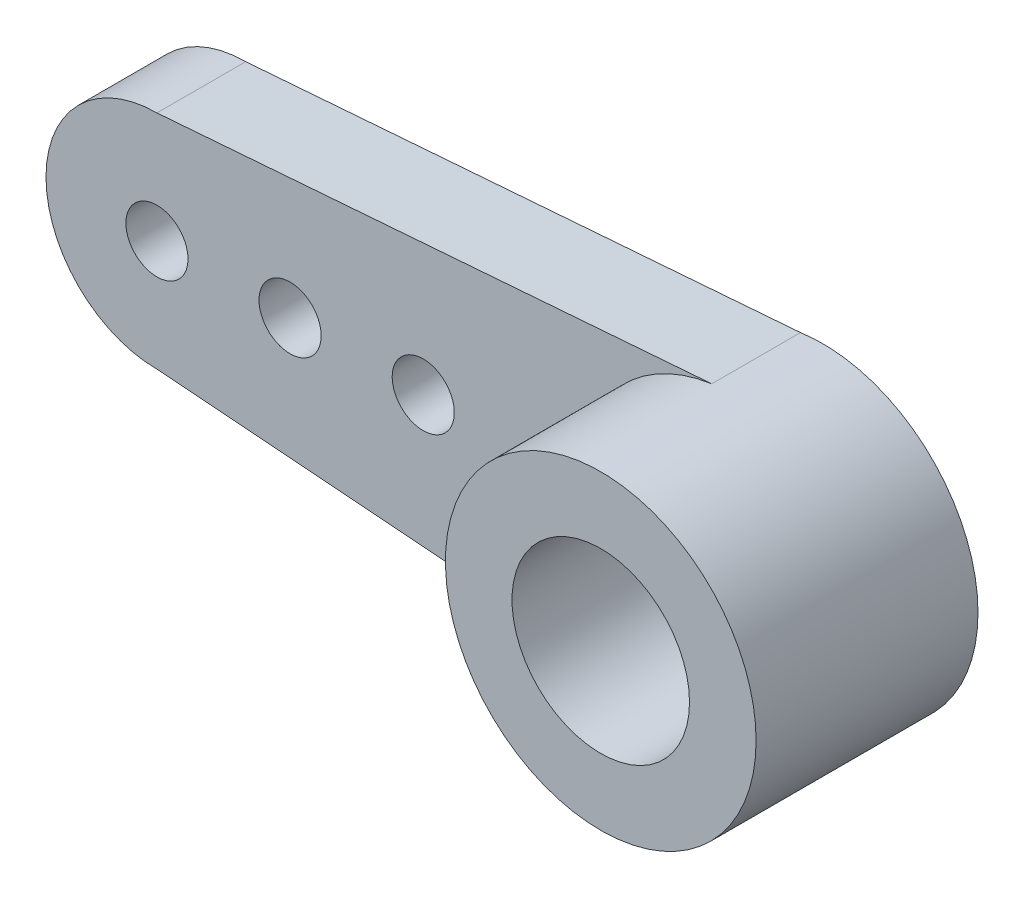
ISO-10303-21;
HEADER;
FILE_DESCRIPTION(('STEP AP214'),'2;1');
FILE_NAME('part.step','',(''),(''),'','','');
FILE_SCHEMA(('AUTOMOTIVE_DESIGN { 1 0 10303 214 1 1 1 1 }'));
ENDSEC;
DATA;
#1=APPLICATION_CONTEXT('core data for automotive mechanical design processes');
#2=APPLICATION_PROTOCOL_DEFINITION('international standard','automotive_design',2000,#1);
#3=PRODUCT_CONTEXT('',#1,'mechanical');
#4=PRODUCT('Part','Part','',(#3));
#5=PRODUCT_RELATED_PRODUCT_CATEGORY('part','',(#4));
#6=PRODUCT_DEFINITION_FORMATION('','',#4);
#7=PRODUCT_DEFINITION_CONTEXT('part definition',#1,'design');
#8=PRODUCT_DEFINITION('design','',#6,#7);
#9=PRODUCT_DEFINITION_SHAPE('','',#8);
#10=(LENGTH_UNIT() NAMED_UNIT(*) SI_UNIT(.MILLI.,.METRE.));
#11=(NAMED_UNIT(*) PLANE_ANGLE_UNIT() SI_UNIT($,.RADIAN.));
#12=(NAMED_UNIT(*) SI_UNIT($,.STERADIAN.) SOLID_ANGLE_UNIT());
#13=UNCERTAINTY_MEASURE_WITH_UNIT(LENGTH_MEASURE(1.E-05),#10,'distance_accuracy_value','');
#14=(GEOMETRIC_REPRESENTATION_CONTEXT(3) GLOBAL_UNCERTAINTY_ASSIGNED_CONTEXT((#13)) GLOBAL_UNIT_ASSIGNED_CONTEXT((#10,
#11,#12)) REPRESENTATION_CONTEXT('',''));
#15=CARTESIAN_POINT('',(0.,0.,0.));
#16=DIRECTION('',(0.,0.,1.));
#17=DIRECTION('',(1.,0.,0.));
#18=AXIS2_PLACEMENT_3D('',#15,#16,#17);
#19=CARTESIAN_POINT('',(0.,0.,5.));
#20=DIRECTION('',(0.,0.,1.));
#21=DIRECTION('',(1.,0.,0.));
#22=AXIS2_PLACEMENT_3D('',#19,#20,#21);
#23=PLANE('',#22);
#24=CARTESIAN_POINT('',(0.,0.,5.));
#25=DIRECTION('',(0.,0.,1.));
#26=DIRECTION('',(1.,0.,0.));
#27=AXIS2_PLACEMENT_3D('',#24,#25,#26);
#28=CIRCLE('',#27,3.5);
#29=CARTESIAN_POINT('',(3.5,0.,5.));
#30=VERTEX_POINT('',#29);
#31=EDGE_CURVE('E11',#30,#30,#28,.T.);
#32=ORIENTED_EDGE('',*,*,#31,.T.);
#33=EDGE_LOOP('',(#32));
#34=FACE_BOUND('',#33,.T.);
#35=CARTESIAN_POINT('',(0.,0.,5.));
#36=DIRECTION('',(0.,0.,1.));
#37=DIRECTION('',(1.,0.,0.));
#38=AXIS2_PLACEMENT_3D('',#35,#36,#37);
#39=CIRCLE('',#38,2.);
#40=CARTESIAN_POINT('',(2.,0.,5.));
#41=VERTEX_POINT('',#40);
#42=EDGE_CURVE('E119',#41,#41,#39,.T.);
#43=ORIENTED_EDGE('',*,*,#42,.F.);
#44=EDGE_LOOP('',(#43));
#45=FACE_BOUND('',#44,.T.);
#46=ADVANCED_FACE('F39',(#34,#45),#23,.T.);
#47=CARTESIAN_POINT('',(0.,0.,0.));
#48=DIRECTION('',(0.,0.,1.));
#49=DIRECTION('',(1.,0.,0.));
#50=AXIS2_PLACEMENT_3D('',#47,#48,#49);
#51=PLANE('',#50);
#52=CARTESIAN_POINT('',(0.,0.,0.));
#53=DIRECTION('',(0.,0.,1.));
#54=DIRECTION('',(1.,0.,0.));
#55=AXIS2_PLACEMENT_3D('',#52,#53,#54);
#56=CIRCLE('',#55,3.5);
#57=CARTESIAN_POINT('',(-0.499445817220934,-3.46418155928071,0.));
#58=VERTEX_POINT('',#57);
#59=CARTESIAN_POINT('',(-0.499445817220942,3.46418155928071,0.));
#60=VERTEX_POINT('',#59);
#61=EDGE_CURVE('E43',#58,#60,#56,.T.);
#62=ORIENTED_EDGE('',*,*,#61,.F.);
#63=DIRECTION('',(-0.997038603249255,0.0769026893598254,0.));
#64=VECTOR('',#63,1.);
#65=CARTESIAN_POINT('',(-0.499445817220934,-3.46418155928071,0.));
#66=LINE('',#65,#64);
#67=CARTESIAN_POINT('',(-13.,-2.5,0.));
#68=VERTEX_POINT('',#67);
#69=EDGE_CURVE('E110',#58,#68,#66,.T.);
#70=ORIENTED_EDGE('',*,*,#69,.T.);
#71=CARTESIAN_POINT('',(-13.,0.,0.));
#72=DIRECTION('',(0.,0.,-1.));
#73=DIRECTION('',(-1.,0.,0.));
#74=AXIS2_PLACEMENT_3D('',#71,#72,#73);
#75=CIRCLE('',#74,2.5);
#76=CARTESIAN_POINT('',(-13.,2.5,0.));
#77=VERTEX_POINT('',#76);
#78=EDGE_CURVE('E85',#68,#77,#75,.T.);
#79=ORIENTED_EDGE('',*,*,#78,.T.);
#80=DIRECTION('',(0.997038603249255,0.0769026893598254,0.));
#81=VECTOR('',#80,1.);
#82=CARTESIAN_POINT('',(-0.499445817220934,3.46418155928071,0.));
#83=LINE('',#82,#81);
#84=EDGE_CURVE('E101',#77,#60,#83,.T.);
#85=ORIENTED_EDGE('',*,*,#84,.T.);
#86=EDGE_LOOP('',(#62,#70,#79,#85));
#87=FACE_BOUND('',#86,.T.);
#88=CARTESIAN_POINT('',(0.,0.,0.));
#89=DIRECTION('',(0.,0.,1.));
#90=DIRECTION('',(1.,0.,0.));
#91=AXIS2_PLACEMENT_3D('',#88,#89,#90);
#92=CIRCLE('',#91,2.);
#93=CARTESIAN_POINT('',(2.,0.,0.));
#94=VERTEX_POINT('',#93);
#95=EDGE_CURVE('E118',#94,#94,#92,.T.);
#96=ORIENTED_EDGE('',*,*,#95,.T.);
#97=EDGE_LOOP('',(#96));
#98=FACE_BOUND('',#97,.T.);
#99=CARTESIAN_POINT('',(-7.,0.,0.));
#100=DIRECTION('',(0.,0.,-1.));
#101=DIRECTION('',(-1.,0.,0.));
#102=AXIS2_PLACEMENT_3D('',#99,#100,#101);
#103=CIRCLE('',#102,0.700000000000001);
#104=CARTESIAN_POINT('',(-7.7,0.,0.));
#105=VERTEX_POINT('',#104);
#106=EDGE_CURVE('E106',#105,#105,#103,.T.);
#107=ORIENTED_EDGE('',*,*,#106,.F.);
#108=EDGE_LOOP('',(#107));
#109=FACE_BOUND('',#108,.T.);
#110=CARTESIAN_POINT('',(-10.,0.,0.));
#111=DIRECTION('',(0.,0.,-1.));
#112=DIRECTION('',(-1.,0.,0.));
#113=AXIS2_PLACEMENT_3D('',#110,#111,#112);
#114=CIRCLE('',#113,0.7);
#115=CARTESIAN_POINT('',(-10.7,0.,0.));
#116=VERTEX_POINT('',#115);
#117=EDGE_CURVE('E175',#116,#116,#114,.T.);
#118=ORIENTED_EDGE('',*,*,#117,.F.);
#119=EDGE_LOOP('',(#118));
#120=FACE_BOUND('',#119,.T.);
#121=CARTESIAN_POINT('',(-13.,0.,0.));
#122=DIRECTION('',(0.,0.,-1.));
#123=DIRECTION('',(-1.,0.,0.));
#124=AXIS2_PLACEMENT_3D('',#121,#122,#123);
#125=CIRCLE('',#124,0.7);
#126=CARTESIAN_POINT('',(-13.7,0.,0.));
#127=VERTEX_POINT('',#126);
#128=EDGE_CURVE('E172',#127,#127,#125,.T.);
#129=ORIENTED_EDGE('',*,*,#128,.F.);
#130=EDGE_LOOP('',(#129));
#131=FACE_BOUND('',#130,.T.);
#132=ADVANCED_FACE('F125',(#87,#98,#109,#120,#131),#51,.F.);
#133=CARTESIAN_POINT('',(0.,0.,5.));
#134=DIRECTION('',(0.,0.,-1.));
#135=DIRECTION('',(-1.,0.,0.));
#136=AXIS2_PLACEMENT_3D('',#133,#134,#135);
#137=CYLINDRICAL_SURFACE('',#136,3.5);
#138=ORIENTED_EDGE('',*,*,#61,.T.);
#139=DIRECTION('',(0.,0.,-1.));
#140=VECTOR('',#139,1.);
#141=CARTESIAN_POINT('',(-0.499445817220934,3.46418155928071,2.));
#142=LINE('',#141,#140);
#143=CARTESIAN_POINT('',(-0.499445817220934,3.46418155928071,2.));
#144=VERTEX_POINT('',#143);
#145=EDGE_CURVE('E54',#144,#60,#142,.T.);
#146=ORIENTED_EDGE('',*,*,#145,.F.);
#147=CARTESIAN_POINT('',(0.,0.,2.));
#148=DIRECTION('',(0.,0.,-1.));
#149=DIRECTION('',(-1.,0.,0.));
#150=AXIS2_PLACEMENT_3D('',#147,#148,#149);
#151=CIRCLE('',#150,3.5);
#152=CARTESIAN_POINT('',(-0.499445817220934,-3.46418155928071,2.));
#153=VERTEX_POINT('',#152);
#154=EDGE_CURVE('E58',#153,#144,#151,.T.);
#155=ORIENTED_EDGE('',*,*,#154,.F.);
#156=DIRECTION('',(0.,0.,-1.));
#157=VECTOR('',#156,1.);
#158=CARTESIAN_POINT('',(-0.499445817220934,-3.46418155928071,2.));
#159=LINE('',#158,#157);
#160=EDGE_CURVE('E91',#153,#58,#159,.T.);
#161=ORIENTED_EDGE('',*,*,#160,.T.);
#162=EDGE_LOOP('',(#138,#146,#155,#161));
#163=FACE_BOUND('',#162,.T.);
#164=ORIENTED_EDGE('',*,*,#31,.F.);
#165=EDGE_LOOP('',(#164));
#166=FACE_BOUND('',#165,.T.);
#167=ADVANCED_FACE('F41',(#163,#166),#137,.T.);
#168=CARTESIAN_POINT('',(0.,0.,5.));
#169=DIRECTION('',(0.,0.,-1.));
#170=DIRECTION('',(-1.,0.,0.));
#171=AXIS2_PLACEMENT_3D('',#168,#169,#170);
#172=CYLINDRICAL_SURFACE('',#171,2.);
#173=ORIENTED_EDGE('',*,*,#95,.F.);
#174=EDGE_LOOP('',(#173));
#175=FACE_BOUND('',#174,.T.);
#176=ORIENTED_EDGE('',*,*,#42,.T.);
#177=EDGE_LOOP('',(#176));
#178=FACE_BOUND('',#177,.T.);
#179=ADVANCED_FACE('F128',(#175,#178),#172,.F.);
#180=CARTESIAN_POINT('',(0.,0.,2.));
#181=DIRECTION('',(0.,0.,-1.));
#182=DIRECTION('',(-1.,0.,0.));
#183=AXIS2_PLACEMENT_3D('',#180,#181,#182);
#184=PLANE('',#183);
#185=CARTESIAN_POINT('',(-7.,0.,2.));
#186=DIRECTION('',(0.,0.,-1.));
#187=DIRECTION('',(-1.,0.,0.));
#188=AXIS2_PLACEMENT_3D('',#185,#186,#187);
#189=CIRCLE('',#188,0.700000000000001);
#190=CARTESIAN_POINT('',(-7.7,0.,2.));
#191=VERTEX_POINT('',#190);
#192=EDGE_CURVE('E112',#191,#191,#189,.T.);
#193=ORIENTED_EDGE('',*,*,#192,.T.);
#194=EDGE_LOOP('',(#193));
#195=FACE_BOUND('',#194,.T.);
#196=CARTESIAN_POINT('',(-10.,0.,2.));
#197=DIRECTION('',(0.,0.,-1.));
#198=DIRECTION('',(-1.,0.,0.));
#199=AXIS2_PLACEMENT_3D('',#196,#197,#198);
#200=CIRCLE('',#199,0.7);
#201=CARTESIAN_POINT('',(-10.7,0.,2.));
#202=VERTEX_POINT('',#201);
#203=EDGE_CURVE('E178',#202,#202,#200,.T.);
#204=ORIENTED_EDGE('',*,*,#203,.T.);
#205=EDGE_LOOP('',(#204));
#206=FACE_BOUND('',#205,.T.);
#207=CARTESIAN_POINT('',(-13.,0.,2.));
#208=DIRECTION('',(0.,0.,-1.));
#209=DIRECTION('',(-1.,0.,0.));
#210=AXIS2_PLACEMENT_3D('',#207,#208,#209);
#211=CIRCLE('',#210,0.7);
#212=CARTESIAN_POINT('',(-13.7,0.,2.));
#213=VERTEX_POINT('',#212);
#214=EDGE_CURVE('E169',#213,#213,#211,.T.);
#215=ORIENTED_EDGE('',*,*,#214,.T.);
#216=EDGE_LOOP('',(#215));
#217=FACE_BOUND('',#216,.T.);
#218=DIRECTION('',(-0.997038603249255,0.0769026893598254,0.));
#219=VECTOR('',#218,1.);
#220=CARTESIAN_POINT('',(-0.499445817220934,-3.46418155928071,2.));
#221=LINE('',#220,#219);
#222=CARTESIAN_POINT('',(-13.,-2.5,2.));
#223=VERTEX_POINT('',#222);
#224=EDGE_CURVE('E96',#153,#223,#221,.T.);
#225=ORIENTED_EDGE('',*,*,#224,.F.);
#226=ORIENTED_EDGE('',*,*,#154,.T.);
#227=DIRECTION('',(0.997038603249255,0.0769026893598254,0.));
#228=VECTOR('',#227,1.);
#229=CARTESIAN_POINT('',(-0.499445817220934,3.46418155928071,2.));
#230=LINE('',#229,#228);
#231=CARTESIAN_POINT('',(-13.,2.5,2.));
#232=VERTEX_POINT('',#231);
#233=EDGE_CURVE('E98',#232,#144,#230,.T.);
#234=ORIENTED_EDGE('',*,*,#233,.F.);
#235=CARTESIAN_POINT('',(-13.,0.,2.));
#236=DIRECTION('',(0.,0.,-1.));
#237=DIRECTION('',(-1.,0.,0.));
#238=AXIS2_PLACEMENT_3D('',#235,#236,#237);
#239=CIRCLE('',#238,2.5);
#240=EDGE_CURVE('E82',#223,#232,#239,.T.);
#241=ORIENTED_EDGE('',*,*,#240,.F.);
#242=EDGE_LOOP('',(#225,#226,#234,#241));
#243=FACE_BOUND('',#242,.T.);
#244=ADVANCED_FACE('F95',(#195,#206,#217,#243),#184,.F.);
#245=CARTESIAN_POINT('',(-0.499445817220934,3.46418155928071,2.));
#246=DIRECTION('',(-0.0769026893598254,0.997038603249255,0.));
#247=DIRECTION('',(-0.997038603249256,-0.0769026893598255,0.));
#248=AXIS2_PLACEMENT_3D('',#245,#246,#247);
#249=PLANE('',#248);
#250=ORIENTED_EDGE('',*,*,#84,.F.);
#251=DIRECTION('',(0.,0.,-1.));
#252=VECTOR('',#251,1.);
#253=CARTESIAN_POINT('',(-13.,2.5,2.));
#254=LINE('',#253,#252);
#255=EDGE_CURVE('E90',#232,#77,#254,.T.);
#256=ORIENTED_EDGE('',*,*,#255,.F.);
#257=ORIENTED_EDGE('',*,*,#233,.T.);
#258=ORIENTED_EDGE('',*,*,#145,.T.);
#259=EDGE_LOOP('',(#250,#256,#257,#258));
#260=FACE_BOUND('',#259,.T.);
#261=ADVANCED_FACE('F147',(#260),#249,.T.);
#262=CARTESIAN_POINT('',(-13.,0.,2.));
#263=DIRECTION('',(0.,0.,-1.));
#264=DIRECTION('',(-1.,0.,0.));
#265=AXIS2_PLACEMENT_3D('',#262,#263,#264);
#266=CYLINDRICAL_SURFACE('',#265,2.5);
#267=ORIENTED_EDGE('',*,*,#78,.F.);
#268=DIRECTION('',(0.,0.,-1.));
#269=VECTOR('',#268,1.);
#270=CARTESIAN_POINT('',(-13.,-2.5,2.));
#271=LINE('',#270,#269);
#272=EDGE_CURVE('E79',#223,#68,#271,.T.);
#273=ORIENTED_EDGE('',*,*,#272,.F.);
#274=ORIENTED_EDGE('',*,*,#240,.T.);
#275=ORIENTED_EDGE('',*,*,#255,.T.);
#276=EDGE_LOOP('',(#267,#273,#274,#275));
#277=FACE_BOUND('',#276,.T.);
#278=ADVANCED_FACE('F81',(#277),#266,.T.);
#279=CARTESIAN_POINT('',(-0.499445817220934,-3.46418155928071,2.));
#280=DIRECTION('',(-0.0769026893598254,-0.997038603249255,0.));
#281=DIRECTION('',(0.997038603249256,-0.0769026893598255,0.));
#282=AXIS2_PLACEMENT_3D('',#279,#280,#281);
#283=PLANE('',#282);
#284=ORIENTED_EDGE('',*,*,#69,.F.);
#285=ORIENTED_EDGE('',*,*,#160,.F.);
#286=ORIENTED_EDGE('',*,*,#224,.T.);
#287=ORIENTED_EDGE('',*,*,#272,.T.);
#288=EDGE_LOOP('',(#284,#285,#286,#287));
#289=FACE_BOUND('',#288,.T.);
#290=ADVANCED_FACE('F100',(#289),#283,.T.);
#291=CARTESIAN_POINT('',(-7.,0.,2.));
#292=DIRECTION('',(0.,0.,-1.));
#293=DIRECTION('',(-1.,0.,0.));
#294=AXIS2_PLACEMENT_3D('',#291,#292,#293);
#295=CYLINDRICAL_SURFACE('',#294,0.700000000000001);
#296=ORIENTED_EDGE('',*,*,#192,.F.);
#297=EDGE_LOOP('',(#296));
#298=FACE_BOUND('',#297,.T.);
#299=ORIENTED_EDGE('',*,*,#106,.T.);
#300=EDGE_LOOP('',(#299));
#301=FACE_BOUND('',#300,.T.);
#302=ADVANCED_FACE('F144',(#298,#301),#295,.F.);
#303=CARTESIAN_POINT('',(-10.,0.,2.));
#304=DIRECTION('',(0.,0.,-1.));
#305=DIRECTION('',(-1.,0.,0.));
#306=AXIS2_PLACEMENT_3D('',#303,#304,#305);
#307=CYLINDRICAL_SURFACE('',#306,0.7);
#308=ORIENTED_EDGE('',*,*,#203,.F.);
#309=EDGE_LOOP('',(#308));
#310=FACE_BOUND('',#309,.T.);
#311=ORIENTED_EDGE('',*,*,#117,.T.);
#312=EDGE_LOOP('',(#311));
#313=FACE_BOUND('',#312,.T.);
#314=ADVANCED_FACE('F156',(#310,#313),#307,.F.);
#315=CARTESIAN_POINT('',(-13.,0.,2.));
#316=DIRECTION('',(0.,0.,-1.));
#317=DIRECTION('',(-1.,0.,0.));
#318=AXIS2_PLACEMENT_3D('',#315,#316,#317);
#319=CYLINDRICAL_SURFACE('',#318,0.7);
#320=ORIENTED_EDGE('',*,*,#214,.F.);
#321=EDGE_LOOP('',(#320));
#322=FACE_BOUND('',#321,.T.);
#323=ORIENTED_EDGE('',*,*,#128,.T.);
#324=EDGE_LOOP('',(#323));
#325=FACE_BOUND('',#324,.T.);
#326=ADVANCED_FACE('F160',(#322,#325),#319,.F.);
#327=CLOSED_SHELL('',(#46,#132,#167,#179,#244,#261,#278,#290,#302,#314,#326));
#328=MANIFOLD_SOLID_BREP('B2',#327);
#329=ADVANCED_BREP_SHAPE_REPRESENTATION('',(#18,#328),#14);
#330=SHAPE_DEFINITION_REPRESENTATION(#9,#329);
ENDSEC;
END-ISO-10303-21;
